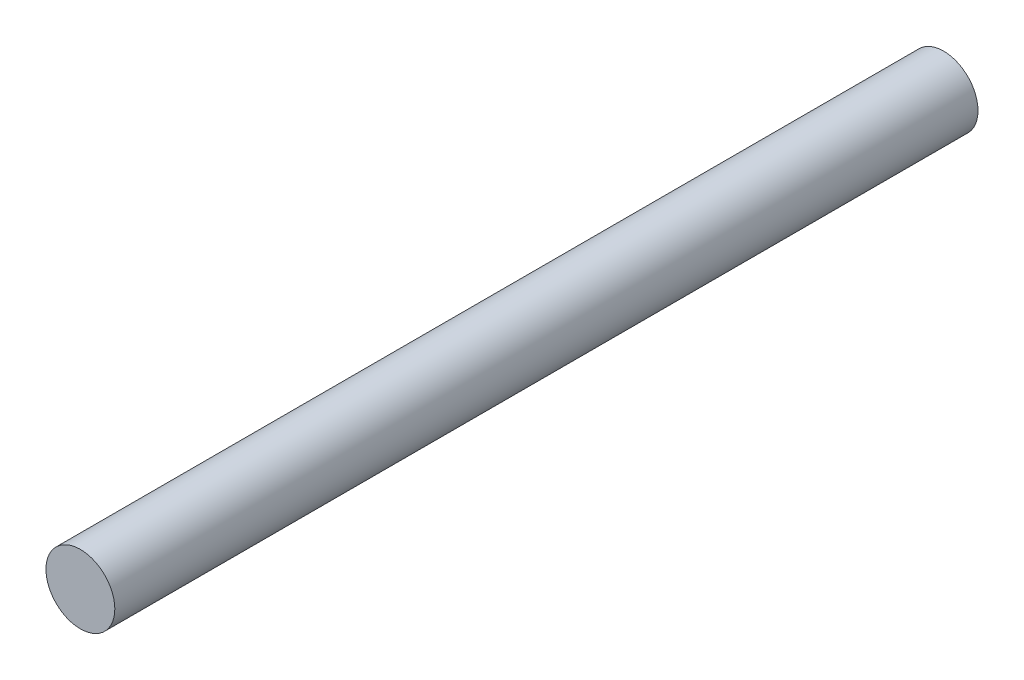
ISO-10303-21;
HEADER;
FILE_DESCRIPTION(('STEP AP214'),'2;1');
FILE_NAME('part.step','',(''),(''),'','','');
FILE_SCHEMA(('AUTOMOTIVE_DESIGN { 1 0 10303 214 1 1 1 1 }'));
ENDSEC;
DATA;
#1=APPLICATION_CONTEXT('core data for automotive mechanical design processes');
#2=APPLICATION_PROTOCOL_DEFINITION('international standard','automotive_design',2000,#1);
#3=PRODUCT_CONTEXT('',#1,'mechanical');
#4=PRODUCT('Part','Part','',(#3));
#5=PRODUCT_RELATED_PRODUCT_CATEGORY('part','',(#4));
#6=PRODUCT_DEFINITION_FORMATION('','',#4);
#7=PRODUCT_DEFINITION_CONTEXT('part definition',#1,'design');
#8=PRODUCT_DEFINITION('design','',#6,#7);
#9=PRODUCT_DEFINITION_SHAPE('','',#8);
#10=(LENGTH_UNIT() NAMED_UNIT(*) SI_UNIT(.MILLI.,.METRE.));
#11=(NAMED_UNIT(*) PLANE_ANGLE_UNIT() SI_UNIT($,.RADIAN.));
#12=(NAMED_UNIT(*) SI_UNIT($,.STERADIAN.) SOLID_ANGLE_UNIT());
#13=UNCERTAINTY_MEASURE_WITH_UNIT(LENGTH_MEASURE(1.E-05),#10,'distance_accuracy_value','');
#14=(GEOMETRIC_REPRESENTATION_CONTEXT(3) GLOBAL_UNCERTAINTY_ASSIGNED_CONTEXT((#13)) GLOBAL_UNIT_ASSIGNED_CONTEXT((#10,
#11,#12)) REPRESENTATION_CONTEXT('',''));
#15=CARTESIAN_POINT('',(0.,0.,0.));
#16=DIRECTION('',(0.,0.,1.));
#17=DIRECTION('',(1.,0.,0.));
#18=AXIS2_PLACEMENT_3D('',#15,#16,#17);
#19=CARTESIAN_POINT('',(0.,0.,25.));
#20=DIRECTION('',(0.,0.,-1.));
#21=DIRECTION('',(-1.,0.,0.));
#22=AXIS2_PLACEMENT_3D('',#19,#20,#21);
#23=CYLINDRICAL_SURFACE('',#22,0.9974999354);
#24=CARTESIAN_POINT('',(0.,0.,25.));
#25=DIRECTION('',(0.,0.,1.));
#26=DIRECTION('',(1.,0.,0.));
#27=AXIS2_PLACEMENT_3D('',#24,#25,#26);
#28=CIRCLE('',#27,0.9974999354);
#29=CARTESIAN_POINT('',(0.9974999354,0.,25.));
#30=VERTEX_POINT('',#29);
#31=EDGE_CURVE('E10',#30,#30,#28,.T.);
#32=ORIENTED_EDGE('',*,*,#31,.F.);
#33=EDGE_LOOP('',(#32));
#34=FACE_BOUND('',#33,.T.);
#35=CARTESIAN_POINT('',(0.,0.,0.));
#36=DIRECTION('',(0.,0.,1.));
#37=DIRECTION('',(1.,0.,0.));
#38=AXIS2_PLACEMENT_3D('',#35,#36,#37);
#39=CIRCLE('',#38,0.9974999354);
#40=CARTESIAN_POINT('',(0.9974999354,0.,0.));
#41=VERTEX_POINT('',#40);
#42=EDGE_CURVE('E46',#41,#41,#39,.T.);
#43=ORIENTED_EDGE('',*,*,#42,.T.);
#44=EDGE_LOOP('',(#43));
#45=FACE_BOUND('',#44,.T.);
#46=ADVANCED_FACE('F43',(#34,#45),#23,.T.);
#47=CARTESIAN_POINT('',(0.,0.,25.));
#48=DIRECTION('',(0.,0.,1.));
#49=DIRECTION('',(1.,0.,0.));
#50=AXIS2_PLACEMENT_3D('',#47,#48,#49);
#51=PLANE('',#50);
#52=ORIENTED_EDGE('',*,*,#31,.T.);
#53=EDGE_LOOP('',(#52));
#54=FACE_BOUND('',#53,.T.);
#55=ADVANCED_FACE('F60',(#54),#51,.T.);
#56=CARTESIAN_POINT('',(0.,0.,0.));
#57=DIRECTION('',(0.,0.,1.));
#58=DIRECTION('',(1.,0.,0.));
#59=AXIS2_PLACEMENT_3D('',#56,#57,#58);
#60=PLANE('',#59);
#61=ORIENTED_EDGE('',*,*,#42,.F.);
#62=EDGE_LOOP('',(#61));
#63=FACE_BOUND('',#62,.T.);
#64=ADVANCED_FACE('F58',(#63),#60,.F.);
#65=CLOSED_SHELL('',(#46,#55,#64));
#66=MANIFOLD_SOLID_BREP('B2',#65);
#67=ADVANCED_BREP_SHAPE_REPRESENTATION('',(#18,#66),#14);
#68=SHAPE_DEFINITION_REPRESENTATION(#9,#67);
ENDSEC;
END-ISO-10303-21;
